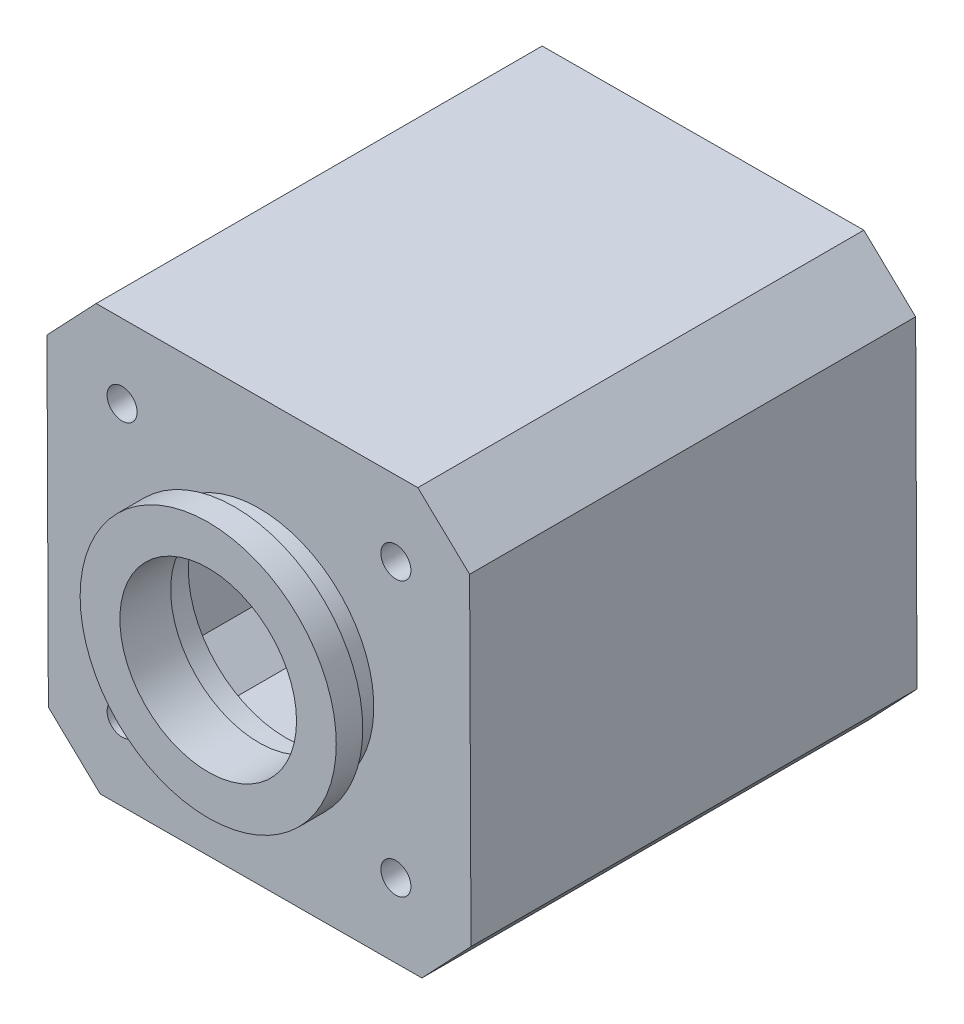
ISO-10303-21;
HEADER;
FILE_DESCRIPTION(('STEP AP214'),'2;1');
FILE_NAME('part.step','',(''),(''),'','','');
FILE_SCHEMA(('AUTOMOTIVE_DESIGN { 1 0 10303 214 1 1 1 1 }'));
ENDSEC;
DATA;
#1=APPLICATION_CONTEXT('core data for automotive mechanical design processes');
#2=APPLICATION_PROTOCOL_DEFINITION('international standard','automotive_design',2000,#1);
#3=PRODUCT_CONTEXT('',#1,'mechanical');
#4=PRODUCT('Part','Part','',(#3));
#5=PRODUCT_RELATED_PRODUCT_CATEGORY('part','',(#4));
#6=PRODUCT_DEFINITION_FORMATION('','',#4);
#7=PRODUCT_DEFINITION_CONTEXT('part definition',#1,'design');
#8=PRODUCT_DEFINITION('design','',#6,#7);
#9=PRODUCT_DEFINITION_SHAPE('','',#8);
#10=(LENGTH_UNIT() NAMED_UNIT(*) SI_UNIT(.MILLI.,.METRE.));
#11=(NAMED_UNIT(*) PLANE_ANGLE_UNIT() SI_UNIT($,.RADIAN.));
#12=(NAMED_UNIT(*) SI_UNIT($,.STERADIAN.) SOLID_ANGLE_UNIT());
#13=UNCERTAINTY_MEASURE_WITH_UNIT(LENGTH_MEASURE(1.E-05),#10,'distance_accuracy_value','');
#14=(GEOMETRIC_REPRESENTATION_CONTEXT(3) GLOBAL_UNCERTAINTY_ASSIGNED_CONTEXT((#13)) GLOBAL_UNIT_ASSIGNED_CONTEXT((#10,
#11,#12)) REPRESENTATION_CONTEXT('',''));
#15=CARTESIAN_POINT('',(0.,0.,0.));
#16=DIRECTION('',(0.,0.,1.));
#17=DIRECTION('',(1.,0.,0.));
#18=AXIS2_PLACEMENT_3D('',#15,#16,#17);
#19=CARTESIAN_POINT('',(-0.058605732675205,-0.398232278057636,10.25));
#20=DIRECTION('',(0.,0.,-1.));
#21=DIRECTION('',(-1.,0.,0.));
#22=AXIS2_PLACEMENT_3D('',#19,#20,#21);
#23=CYLINDRICAL_SURFACE('',#22,13.);
#24=CARTESIAN_POINT('',(-0.058605732675205,-0.398232278057636,3.));
#25=DIRECTION('',(0.,0.,-1.));
#26=DIRECTION('',(-1.,0.,0.));
#27=AXIS2_PLACEMENT_3D('',#24,#25,#26);
#28=CIRCLE('',#27,13.);
#29=CARTESIAN_POINT('',(-13.0586057326752,-0.398232278057636,3.));
#30=VERTEX_POINT('',#29);
#31=EDGE_CURVE('E54',#30,#30,#28,.F.);
#32=CARTESIAN_POINT('',(-0.058605732675205,-0.398232278057636,5.75));
#33=DIRECTION('',(0.,0.,1.));
#34=DIRECTION('',(1.,0.,0.));
#35=AXIS2_PLACEMENT_3D('',#32,#33,#34);
#36=CIRCLE('',#35,13.);
#37=CARTESIAN_POINT('',(-13.0586057326752,-0.398232278057636,5.75));
#38=VERTEX_POINT('',#37);
#39=EDGE_CURVE('E11',#38,#38,#36,.T.);
#40=CARTESIAN_POINT('',(-13.0586057326752,-0.398232278057636,3.));
#41=CARTESIAN_POINT('',(-13.0586057326752,-0.398232278057636,3.02864583333333));
#42=CARTESIAN_POINT('',(-13.0586057326752,-0.398232278057636,3.05729166666667));
#43=CARTESIAN_POINT('',(-13.0586057326752,-0.398232278057636,3.11458333333333));
#44=CARTESIAN_POINT('',(-13.0586057326752,-0.398232278057636,3.14322916666667));
#45=CARTESIAN_POINT('',(-13.0586057326752,-0.398232278057636,3.20052083333333));
#46=CARTESIAN_POINT('',(-13.0586057326752,-0.398232278057636,3.22916666666667));
#47=CARTESIAN_POINT('',(-13.0586057326752,-0.398232278057636,3.28645833333333));
#48=CARTESIAN_POINT('',(-13.0586057326752,-0.398232278057636,3.31510416666667));
#49=CARTESIAN_POINT('',(-13.0586057326752,-0.398232278057636,3.37239583333333));
#50=CARTESIAN_POINT('',(-13.0586057326752,-0.398232278057636,3.40104166666667));
#51=CARTESIAN_POINT('',(-13.0586057326752,-0.398232278057636,3.45833333333333));
#52=CARTESIAN_POINT('',(-13.0586057326752,-0.398232278057636,3.48697916666667));
#53=CARTESIAN_POINT('',(-13.0586057326752,-0.398232278057636,3.54427083333333));
#54=CARTESIAN_POINT('',(-13.0586057326752,-0.398232278057636,3.57291666666667));
#55=CARTESIAN_POINT('',(-13.0586057326752,-0.398232278057636,3.63020833333333));
#56=CARTESIAN_POINT('',(-13.0586057326752,-0.398232278057636,3.65885416666667));
#57=CARTESIAN_POINT('',(-13.0586057326752,-0.398232278057636,3.71614583333333));
#58=CARTESIAN_POINT('',(-13.0586057326752,-0.398232278057636,3.74479166666667));
#59=CARTESIAN_POINT('',(-13.0586057326752,-0.398232278057636,3.80208333333333));
#60=CARTESIAN_POINT('',(-13.0586057326752,-0.398232278057636,3.83072916666667));
#61=CARTESIAN_POINT('',(-13.0586057326752,-0.398232278057636,3.88802083333333));
#62=CARTESIAN_POINT('',(-13.0586057326752,-0.398232278057636,3.91666666666667));
#63=CARTESIAN_POINT('',(-13.0586057326752,-0.398232278057636,3.97395833333333));
#64=CARTESIAN_POINT('',(-13.0586057326752,-0.398232278057636,4.00260416666667));
#65=CARTESIAN_POINT('',(-13.0586057326752,-0.398232278057636,4.05989583333333));
#66=CARTESIAN_POINT('',(-13.0586057326752,-0.398232278057636,4.08854166666667));
#67=CARTESIAN_POINT('',(-13.0586057326752,-0.398232278057636,4.14583333333333));
#68=CARTESIAN_POINT('',(-13.0586057326752,-0.398232278057636,4.17447916666667));
#69=CARTESIAN_POINT('',(-13.0586057326752,-0.398232278057636,4.23177083333333));
#70=CARTESIAN_POINT('',(-13.0586057326752,-0.398232278057636,4.26041666666667));
#71=CARTESIAN_POINT('',(-13.0586057326752,-0.398232278057636,4.31770833333333));
#72=CARTESIAN_POINT('',(-13.0586057326752,-0.398232278057636,4.34635416666667));
#73=CARTESIAN_POINT('',(-13.0586057326752,-0.398232278057636,4.40364583333333));
#74=CARTESIAN_POINT('',(-13.0586057326752,-0.398232278057636,4.43229166666667));
#75=CARTESIAN_POINT('',(-13.0586057326752,-0.398232278057636,4.48958333333333));
#76=CARTESIAN_POINT('',(-13.0586057326752,-0.398232278057636,4.51822916666667));
#77=CARTESIAN_POINT('',(-13.0586057326752,-0.398232278057636,4.57552083333333));
#78=CARTESIAN_POINT('',(-13.0586057326752,-0.398232278057636,4.60416666666667));
#79=CARTESIAN_POINT('',(-13.0586057326752,-0.398232278057636,4.66145833333333));
#80=CARTESIAN_POINT('',(-13.0586057326752,-0.398232278057636,4.69010416666667));
#81=CARTESIAN_POINT('',(-13.0586057326752,-0.398232278057636,4.74739583333333));
#82=CARTESIAN_POINT('',(-13.0586057326752,-0.398232278057636,4.77604166666667));
#83=CARTESIAN_POINT('',(-13.0586057326752,-0.398232278057636,4.83333333333333));
#84=CARTESIAN_POINT('',(-13.0586057326752,-0.398232278057636,4.86197916666667));
#85=CARTESIAN_POINT('',(-13.0586057326752,-0.398232278057636,4.91927083333333));
#86=CARTESIAN_POINT('',(-13.0586057326752,-0.398232278057636,4.94791666666667));
#87=CARTESIAN_POINT('',(-13.0586057326752,-0.398232278057636,5.00520833333333));
#88=CARTESIAN_POINT('',(-13.0586057326752,-0.398232278057636,5.03385416666667));
#89=CARTESIAN_POINT('',(-13.0586057326752,-0.398232278057636,5.09114583333333));
#90=CARTESIAN_POINT('',(-13.0586057326752,-0.398232278057636,5.11979166666667));
#91=CARTESIAN_POINT('',(-13.0586057326752,-0.398232278057636,5.17708333333333));
#92=CARTESIAN_POINT('',(-13.0586057326752,-0.398232278057636,5.20572916666667));
#93=CARTESIAN_POINT('',(-13.0586057326752,-0.398232278057636,5.26302083333333));
#94=CARTESIAN_POINT('',(-13.0586057326752,-0.398232278057636,5.29166666666667));
#95=CARTESIAN_POINT('',(-13.0586057326752,-0.398232278057636,5.34895833333333));
#96=CARTESIAN_POINT('',(-13.0586057326752,-0.398232278057636,5.37760416666667));
#97=CARTESIAN_POINT('',(-13.0586057326752,-0.398232278057636,5.43489583333333));
#98=CARTESIAN_POINT('',(-13.0586057326752,-0.398232278057636,5.46354166666667));
#99=CARTESIAN_POINT('',(-13.0586057326752,-0.398232278057636,5.52083333333333));
#100=CARTESIAN_POINT('',(-13.0586057326752,-0.398232278057636,5.54947916666667));
#101=CARTESIAN_POINT('',(-13.0586057326752,-0.398232278057636,5.60677083333333));
#102=CARTESIAN_POINT('',(-13.0586057326752,-0.398232278057636,5.63541666666667));
#103=CARTESIAN_POINT('',(-13.0586057326752,-0.398232278057636,5.69270833333333));
#104=CARTESIAN_POINT('',(-13.0586057326752,-0.398232278057636,5.72135416666667));
#105=CARTESIAN_POINT('',(-13.0586057326752,-0.398232278057636,5.75));
#106=B_SPLINE_CURVE_WITH_KNOTS('',3,(#40,#41,#42,#43,#44,#45,#46,#47,#48,#49,#50,#51,#52,#53,
#54,#55,#56,#57,#58,#59,#60,#61,#62,#63,#64,#65,#66,#67,#68,#69,#70,#71,#72,#73,#74,#75,#76,#77,
#78,#79,#80,#81,#82,#83,#84,#85,#86,#87,#88,#89,#90,#91,#92,#93,#94,#95,#96,#97,#98,#99,#100,
#101,#102,#103,#104,#105),.UNSPECIFIED.,.F.,.F.,(4,2,2,2,2,2,2,2,2,2,2,2,2,2,2,2,2,2,2,2,2,2,2,
2,2,2,2,2,2,2,2,2,4),(0.,0.0859375000000001,0.171875,0.2578125,0.34375,0.4296875,0.515625,
0.6015625,0.687500000000001,0.7734375,0.859375,0.9453125,1.03125,1.1171875,1.203125,1.2890625,
1.375,1.4609375,1.546875,1.6328125,1.71875,1.8046875,1.890625,1.9765625,2.0625,2.1484375,
2.234375,2.3203125,2.40625,2.4921875,2.578125,2.6640625,2.75),.UNSPECIFIED.);
#107=EDGE_CURVE('BSEAM45',#30,#38,#106,.T.);
#108=ORIENTED_EDGE('',*,*,#31,.T.);
#109=ORIENTED_EDGE('',*,*,#39,.F.);
#110=ORIENTED_EDGE('',*,*,#107,.T.);
#111=ORIENTED_EDGE('',*,*,#107,.F.);
#112=EDGE_LOOP('',(#108,#110,#109,#111));
#113=FACE_BOUND('',#112,.T.);
#114=ADVANCED_FACE('F45',(#113),#23,.T.);
#115=CARTESIAN_POINT('',(-0.058605732675205,-0.398232278057636,-3.75));
#116=DIRECTION('',(0.,0.,1.));
#117=DIRECTION('',(1.,0.,0.));
#118=AXIS2_PLACEMENT_3D('',#115,#116,#117);
#119=CYLINDRICAL_SURFACE('',#118,10.);
#120=CARTESIAN_POINT('',(-0.058605732675205,-0.398232278057636,3.));
#121=DIRECTION('',(0.,0.,1.));
#122=DIRECTION('',(1.,0.,0.));
#123=AXIS2_PLACEMENT_3D('',#120,#121,#122);
#124=CIRCLE('',#123,10.);
#125=CARTESIAN_POINT('',(9.9413942673248,-0.398232278057636,3.));
#126=VERTEX_POINT('',#125);
#127=EDGE_CURVE('E327',#126,#126,#124,.T.);
#128=ORIENTED_EDGE('',*,*,#127,.F.);
#129=EDGE_LOOP('',(#128));
#130=FACE_BOUND('',#129,.T.);
#131=CARTESIAN_POINT('',(-0.058605732675205,-0.398232278057636,8.75));
#132=DIRECTION('',(0.,0.,1.));
#133=DIRECTION('',(1.,0.,0.));
#134=AXIS2_PLACEMENT_3D('',#131,#132,#133);
#135=CIRCLE('',#134,10.);
#136=CARTESIAN_POINT('',(9.9413942673248,-0.398232278057636,8.75));
#137=VERTEX_POINT('',#136);
#138=EDGE_CURVE('E323',#137,#137,#135,.F.);
#139=ORIENTED_EDGE('',*,*,#138,.F.);
#140=EDGE_LOOP('',(#139));
#141=FACE_BOUND('',#140,.T.);
#142=ADVANCED_FACE('F407',(#130,#141),#119,.F.);
#143=CARTESIAN_POINT('',(0.,0.,3.));
#144=DIRECTION('',(0.,0.,-1.));
#145=DIRECTION('',(-1.,0.,0.));
#146=AXIS2_PLACEMENT_3D('',#143,#144,#145);
#147=PLANE('',#146);
#148=ORIENTED_EDGE('',*,*,#31,.F.);
#149=EDGE_LOOP('',(#148));
#150=FACE_BOUND('',#149,.T.);
#151=CARTESIAN_POINT('',(-15.5586057326753,15.1017677219424,3.));
#152=DIRECTION('',(0.,0.,1.));
#153=DIRECTION('',(1.,0.,0.));
#154=AXIS2_PLACEMENT_3D('',#151,#152,#153);
#155=CIRCLE('',#154,1.7);
#156=CARTESIAN_POINT('',(-13.8586057326753,15.1017677219424,3.));
#157=VERTEX_POINT('',#156);
#158=EDGE_CURVE('E361',#157,#157,#155,.T.);
#159=ORIENTED_EDGE('',*,*,#158,.F.);
#160=EDGE_LOOP('',(#159));
#161=FACE_BOUND('',#160,.T.);
#162=CARTESIAN_POINT('',(15.4413942673247,15.1017677219424,3.));
#163=DIRECTION('',(0.,0.,1.));
#164=DIRECTION('',(1.,0.,0.));
#165=AXIS2_PLACEMENT_3D('',#162,#163,#164);
#166=CIRCLE('',#165,1.7);
#167=CARTESIAN_POINT('',(17.1413942673247,15.1017677219424,3.));
#168=VERTEX_POINT('',#167);
#169=EDGE_CURVE('E353',#168,#168,#166,.T.);
#170=ORIENTED_EDGE('',*,*,#169,.F.);
#171=EDGE_LOOP('',(#170));
#172=FACE_BOUND('',#171,.T.);
#173=CARTESIAN_POINT('',(15.4413942673247,-15.8982322780576,3.));
#174=DIRECTION('',(0.,0.,1.));
#175=DIRECTION('',(1.,0.,0.));
#176=AXIS2_PLACEMENT_3D('',#173,#174,#175);
#177=CIRCLE('',#176,1.7);
#178=CARTESIAN_POINT('',(17.1413942673247,-15.8982322780576,3.));
#179=VERTEX_POINT('',#178);
#180=EDGE_CURVE('E345',#179,#179,#177,.T.);
#181=ORIENTED_EDGE('',*,*,#180,.F.);
#182=EDGE_LOOP('',(#181));
#183=FACE_BOUND('',#182,.T.);
#184=CARTESIAN_POINT('',(-15.5586057326753,-15.8982322780576,3.));
#185=DIRECTION('',(0.,0.,1.));
#186=DIRECTION('',(1.,0.,0.));
#187=AXIS2_PLACEMENT_3D('',#184,#185,#186);
#188=CIRCLE('',#187,1.7);
#189=CARTESIAN_POINT('',(-13.8586057326753,-15.8982322780576,3.));
#190=VERTEX_POINT('',#189);
#191=EDGE_CURVE('E336',#190,#190,#188,.T.);
#192=ORIENTED_EDGE('',*,*,#191,.F.);
#193=EDGE_LOOP('',(#192));
#194=FACE_BOUND('',#193,.T.);
#195=DIRECTION('',(-0.00431491145191215,0.99999069072625,0.));
#196=VECTOR('',#195,1.);
#197=CARTESIAN_POINT('',(23.9465632931381,-18.3825867654019,3.));
#198=LINE('',#197,#196);
#199=CARTESIAN_POINT('',(23.9465632931381,-18.3825867654019,3.));
#200=VERTEX_POINT('',#199);
#201=CARTESIAN_POINT('',(23.789391415238,18.042358797378,3.));
#202=VERTEX_POINT('',#201);
#203=EDGE_CURVE('E208',#200,#202,#198,.T.);
#204=ORIENTED_EDGE('',*,*,#203,.T.);
#205=DIRECTION('',(-0.725362707070742,0.688366866714984,0.));
#206=VECTOR('',#205,1.);
#207=CARTESIAN_POINT('',(23.789391415238,18.042358797378,3.));
#208=LINE('',#207,#206);
#209=CARTESIAN_POINT('',(17.9257487546692,23.6069367477556,3.));
#210=VERTEX_POINT('',#209);
#211=EDGE_CURVE('E268',#202,#210,#208,.T.);
#212=ORIENTED_EDGE('',*,*,#211,.T.);
#213=DIRECTION('',(-0.99999069072625,-0.00431491145191209,0.));
#214=VECTOR('',#213,1.);
#215=CARTESIAN_POINT('',(17.9257487546692,23.6069367477556,3.));
#216=LINE('',#215,#214);
#217=CARTESIAN_POINT('',(-18.4991968081112,23.4497648698554,3.));
#218=VERTEX_POINT('',#217);
#219=EDGE_CURVE('E272',#210,#218,#216,.T.);
#220=ORIENTED_EDGE('',*,*,#219,.T.);
#221=DIRECTION('',(-0.688366866714984,-0.725362707070742,0.));
#222=VECTOR('',#221,1.);
#223=CARTESIAN_POINT('',(-24.0637747584885,17.5861222092869,3.));
#224=LINE('',#223,#222);
#225=CARTESIAN_POINT('',(-24.0637747584885,17.5861222092869,3.));
#226=VERTEX_POINT('',#225);
#227=EDGE_CURVE('E276',#218,#226,#224,.T.);
#228=ORIENTED_EDGE('',*,*,#227,.T.);
#229=DIRECTION('',(0.00431491145191209,-0.99999069072625,0.));
#230=VECTOR('',#229,1.);
#231=CARTESIAN_POINT('',(-24.0637747584885,17.5861222092869,3.));
#232=LINE('',#231,#230);
#233=CARTESIAN_POINT('',(-23.9066028805884,-18.8388233534935,3.));
#234=VERTEX_POINT('',#233);
#235=EDGE_CURVE('E280',#226,#234,#232,.T.);
#236=ORIENTED_EDGE('',*,*,#235,.T.);
#237=DIRECTION('',(0.725362707070742,-0.688366866714984,0.));
#238=VECTOR('',#237,1.);
#239=CARTESIAN_POINT('',(-23.9066028805884,-18.8388233534935,3.));
#240=LINE('',#239,#238);
#241=CARTESIAN_POINT('',(-18.0429602200199,-24.4034013038709,3.));
#242=VERTEX_POINT('',#241);
#243=EDGE_CURVE('E284',#234,#242,#240,.T.);
#244=ORIENTED_EDGE('',*,*,#243,.T.);
#245=DIRECTION('',(0.99999069072625,0.00431491145191209,0.));
#246=VECTOR('',#245,1.);
#247=CARTESIAN_POINT('',(-18.0429602200199,-24.4034013038709,3.));
#248=LINE('',#247,#246);
#249=CARTESIAN_POINT('',(18.3819853427606,-24.2462294259707,3.));
#250=VERTEX_POINT('',#249);
#251=EDGE_CURVE('E288',#242,#250,#248,.T.);
#252=ORIENTED_EDGE('',*,*,#251,.T.);
#253=DIRECTION('',(0.688366866714984,0.725362707070743,0.));
#254=VECTOR('',#253,1.);
#255=CARTESIAN_POINT('',(18.3819853427606,-24.2462294259707,3.));
#256=LINE('',#255,#254);
#257=EDGE_CURVE('E236',#250,#200,#256,.T.);
#258=ORIENTED_EDGE('',*,*,#257,.T.);
#259=EDGE_LOOP('',(#204,#212,#220,#228,#236,#244,#252,#258));
#260=FACE_BOUND('',#259,.T.);
#261=ADVANCED_FACE('F409',(#150,#161,#172,#183,#194,#260),#147,.F.);
#262=CARTESIAN_POINT('',(0.,0.,0.));
#263=DIRECTION('',(0.,0.,-1.));
#264=DIRECTION('',(-1.,0.,0.));
#265=AXIS2_PLACEMENT_3D('',#262,#263,#264);
#266=PLANE('',#265);
#267=CARTESIAN_POINT('',(-0.058605732675205,-0.398232278057636,0.));
#268=DIRECTION('',(0.,0.,-1.));
#269=DIRECTION('',(-1.,0.,0.));
#270=AXIS2_PLACEMENT_3D('',#267,#268,#269);
#271=CIRCLE('',#270,11.);
#272=CARTESIAN_POINT('',(-11.0586057326752,-0.398232278057636,0.));
#273=VERTEX_POINT('',#272);
#274=EDGE_CURVE('E335',#273,#273,#271,.T.);
#275=ORIENTED_EDGE('',*,*,#274,.F.);
#276=EDGE_LOOP('',(#275));
#277=FACE_BOUND('',#276,.T.);
#278=CARTESIAN_POINT('',(15.4413942673247,-15.8982322780576,0.));
#279=DIRECTION('',(0.,0.,1.));
#280=DIRECTION('',(1.,0.,0.));
#281=AXIS2_PLACEMENT_3D('',#278,#279,#280);
#282=CIRCLE('',#281,1.7);
#283=CARTESIAN_POINT('',(17.1413942673247,-15.8982322780576,0.));
#284=VERTEX_POINT('',#283);
#285=EDGE_CURVE('E340',#284,#284,#282,.T.);
#286=ORIENTED_EDGE('',*,*,#285,.T.);
#287=EDGE_LOOP('',(#286));
#288=FACE_BOUND('',#287,.T.);
#289=CARTESIAN_POINT('',(-15.5586057326753,15.1017677219424,0.));
#290=DIRECTION('',(0.,0.,1.));
#291=DIRECTION('',(1.,0.,0.));
#292=AXIS2_PLACEMENT_3D('',#289,#290,#291);
#293=CIRCLE('',#292,1.7);
#294=CARTESIAN_POINT('',(-13.8586057326753,15.1017677219424,0.));
#295=VERTEX_POINT('',#294);
#296=EDGE_CURVE('E357',#295,#295,#293,.T.);
#297=ORIENTED_EDGE('',*,*,#296,.T.);
#298=EDGE_LOOP('',(#297));
#299=FACE_BOUND('',#298,.T.);
#300=DIRECTION('',(0.725362707070742,-0.688366866714984,0.));
#301=VECTOR('',#300,1.);
#302=CARTESIAN_POINT('',(-16.8514989514888,-21.3982322780576,0.));
#303=LINE('',#302,#301);
#304=CARTESIAN_POINT('',(-20.9121591232686,-17.5446788874643,0.));
#305=VERTEX_POINT('',#304);
#306=CARTESIAN_POINT('',(-16.8514989514888,-21.3982322780576,0.));
#307=VERTEX_POINT('',#306);
#308=EDGE_CURVE('E61',#305,#307,#303,.T.);
#309=ORIENTED_EDGE('',*,*,#308,.F.);
#310=DIRECTION('',(0.00431491145191209,-0.99999069072625,0.));
#311=VECTOR('',#310,1.);
#312=CARTESIAN_POINT('',(-20.9121591232686,-17.5446788874643,0.));
#313=LINE('',#312,#311);
#314=CARTESIAN_POINT('',(-21.0586057326753,16.3946609407559,0.));
#315=VERTEX_POINT('',#314);
#316=EDGE_CURVE('E65',#315,#305,#313,.T.);
#317=ORIENTED_EDGE('',*,*,#316,.F.);
#318=DIRECTION('',(-0.688366866714984,-0.725362707070742,0.));
#319=VECTOR('',#318,1.);
#320=CARTESIAN_POINT('',(-21.0586057326753,16.3946609407559,0.));
#321=LINE('',#320,#319);
#322=CARTESIAN_POINT('',(-17.205052342082,20.4553211125357,0.));
#323=VERTEX_POINT('',#322);
#324=EDGE_CURVE('E390',#323,#315,#321,.T.);
#325=ORIENTED_EDGE('',*,*,#324,.F.);
#326=DIRECTION('',(-0.99999069072625,-0.00431491145191209,0.));
#327=VECTOR('',#326,1.);
#328=CARTESIAN_POINT('',(-17.205052342082,20.4553211125357,0.));
#329=LINE('',#328,#327);
#330=CARTESIAN_POINT('',(16.7342874861382,20.6017677219424,0.));
#331=VERTEX_POINT('',#330);
#332=EDGE_CURVE('E386',#331,#323,#329,.T.);
#333=ORIENTED_EDGE('',*,*,#332,.F.);
#334=DIRECTION('',(-0.725362707070742,0.688366866714984,0.));
#335=VECTOR('',#334,1.);
#336=CARTESIAN_POINT('',(16.7342874861382,20.6017677219424,0.));
#337=LINE('',#336,#335);
#338=CARTESIAN_POINT('',(20.7949476579182,16.7482143313488,0.));
#339=VERTEX_POINT('',#338);
#340=EDGE_CURVE('E382',#339,#331,#337,.T.);
#341=ORIENTED_EDGE('',*,*,#340,.F.);
#342=DIRECTION('',(-0.00431491145191215,0.99999069072625,0.));
#343=VECTOR('',#342,1.);
#344=CARTESIAN_POINT('',(20.7949476579182,16.7482143313488,0.));
#345=LINE('',#344,#343);
#346=CARTESIAN_POINT('',(20.9413942673249,-17.1911254968709,0.));
#347=VERTEX_POINT('',#346);
#348=EDGE_CURVE('E378',#347,#339,#345,.T.);
#349=ORIENTED_EDGE('',*,*,#348,.F.);
#350=DIRECTION('',(0.688366866714983,0.725362707070743,0.));
#351=VECTOR('',#350,1.);
#352=CARTESIAN_POINT('',(20.9413942673249,-17.1911254968709,0.));
#353=LINE('',#352,#351);
#354=CARTESIAN_POINT('',(17.0878408767314,-21.2517856686509,0.));
#355=VERTEX_POINT('',#354);
#356=EDGE_CURVE('E374',#355,#347,#353,.T.);
#357=ORIENTED_EDGE('',*,*,#356,.F.);
#358=DIRECTION('',(0.99999069072625,0.00431491145191209,0.));
#359=VECTOR('',#358,1.);
#360=CARTESIAN_POINT('',(17.0878408767314,-21.2517856686509,0.));
#361=LINE('',#360,#359);
#362=EDGE_CURVE('E370',#307,#355,#361,.T.);
#363=ORIENTED_EDGE('',*,*,#362,.F.);
#364=EDGE_LOOP('',(#309,#317,#325,#333,#341,#349,#357,#363));
#365=FACE_BOUND('',#364,.T.);
#366=CARTESIAN_POINT('',(15.4413942673247,15.1017677219424,0.));
#367=DIRECTION('',(0.,0.,1.));
#368=DIRECTION('',(1.,0.,0.));
#369=AXIS2_PLACEMENT_3D('',#366,#367,#368);
#370=CIRCLE('',#369,1.7);
#371=CARTESIAN_POINT('',(17.1413942673247,15.1017677219424,0.));
#372=VERTEX_POINT('',#371);
#373=EDGE_CURVE('E349',#372,#372,#370,.T.);
#374=ORIENTED_EDGE('',*,*,#373,.T.);
#375=EDGE_LOOP('',(#374));
#376=FACE_BOUND('',#375,.T.);
#377=CARTESIAN_POINT('',(-15.5586057326753,-15.8982322780576,0.));
#378=DIRECTION('',(0.,0.,1.));
#379=DIRECTION('',(1.,0.,0.));
#380=AXIS2_PLACEMENT_3D('',#377,#378,#379);
#381=CIRCLE('',#380,1.7);
#382=CARTESIAN_POINT('',(-13.8586057326753,-15.8982322780576,0.));
#383=VERTEX_POINT('',#382);
#384=EDGE_CURVE('E341',#383,#383,#381,.T.);
#385=ORIENTED_EDGE('',*,*,#384,.T.);
#386=EDGE_LOOP('',(#385));
#387=FACE_BOUND('',#386,.T.);
#388=ADVANCED_FACE('F47',(#277,#288,#299,#365,#376,#387),#266,.T.);
#389=CARTESIAN_POINT('',(-15.5586057326753,15.1017677219424,3.));
#390=DIRECTION('',(0.,0.,-1.));
#391=DIRECTION('',(-1.,0.,0.));
#392=AXIS2_PLACEMENT_3D('',#389,#390,#391);
#393=CYLINDRICAL_SURFACE('',#392,1.7);
#394=ORIENTED_EDGE('',*,*,#158,.T.);
#395=EDGE_LOOP('',(#394));
#396=FACE_BOUND('',#395,.T.);
#397=ORIENTED_EDGE('',*,*,#296,.F.);
#398=EDGE_LOOP('',(#397));
#399=FACE_BOUND('',#398,.T.);
#400=ADVANCED_FACE('F442',(#396,#399),#393,.F.);
#401=CARTESIAN_POINT('',(15.4413942673247,15.1017677219424,3.));
#402=DIRECTION('',(0.,0.,-1.));
#403=DIRECTION('',(-1.,0.,0.));
#404=AXIS2_PLACEMENT_3D('',#401,#402,#403);
#405=CYLINDRICAL_SURFACE('',#404,1.7);
#406=ORIENTED_EDGE('',*,*,#169,.T.);
#407=EDGE_LOOP('',(#406));
#408=FACE_BOUND('',#407,.T.);
#409=ORIENTED_EDGE('',*,*,#373,.F.);
#410=EDGE_LOOP('',(#409));
#411=FACE_BOUND('',#410,.T.);
#412=ADVANCED_FACE('F438',(#408,#411),#405,.F.);
#413=CARTESIAN_POINT('',(15.4413942673247,-15.8982322780576,3.));
#414=DIRECTION('',(0.,0.,-1.));
#415=DIRECTION('',(-1.,0.,0.));
#416=AXIS2_PLACEMENT_3D('',#413,#414,#415);
#417=CYLINDRICAL_SURFACE('',#416,1.7);
#418=ORIENTED_EDGE('',*,*,#180,.T.);
#419=EDGE_LOOP('',(#418));
#420=FACE_BOUND('',#419,.T.);
#421=ORIENTED_EDGE('',*,*,#285,.F.);
#422=EDGE_LOOP('',(#421));
#423=FACE_BOUND('',#422,.T.);
#424=ADVANCED_FACE('F434',(#420,#423),#417,.F.);
#425=CARTESIAN_POINT('',(-15.5586057326753,-15.8982322780576,3.));
#426=DIRECTION('',(0.,0.,-1.));
#427=DIRECTION('',(-1.,0.,0.));
#428=AXIS2_PLACEMENT_3D('',#425,#426,#427);
#429=CYLINDRICAL_SURFACE('',#428,1.7);
#430=ORIENTED_EDGE('',*,*,#191,.T.);
#431=EDGE_LOOP('',(#430));
#432=FACE_BOUND('',#431,.T.);
#433=ORIENTED_EDGE('',*,*,#384,.F.);
#434=EDGE_LOOP('',(#433));
#435=FACE_BOUND('',#434,.T.);
#436=ADVANCED_FACE('F430',(#432,#435),#429,.F.);
#437=CARTESIAN_POINT('',(-0.058605732675205,-0.398232278057636,-27.));
#438=DIRECTION('',(0.,0.,1.));
#439=DIRECTION('',(1.,0.,0.));
#440=AXIS2_PLACEMENT_3D('',#437,#438,#439);
#441=CYLINDRICAL_SURFACE('',#440,11.);
#442=ORIENTED_EDGE('',*,*,#274,.T.);
#443=EDGE_LOOP('',(#442));
#444=FACE_BOUND('',#443,.T.);
#445=CARTESIAN_POINT('',(-0.058605732675205,-0.398232278057636,3.));
#446=DIRECTION('',(0.,0.,1.));
#447=DIRECTION('',(1.,0.,0.));
#448=AXIS2_PLACEMENT_3D('',#445,#446,#447);
#449=CIRCLE('',#448,11.);
#450=CARTESIAN_POINT('',(10.9413942673248,-0.398232278057636,3.));
#451=VERTEX_POINT('',#450);
#452=EDGE_CURVE('E331',#451,#451,#449,.F.);
#453=ORIENTED_EDGE('',*,*,#452,.F.);
#454=EDGE_LOOP('',(#453));
#455=FACE_BOUND('',#454,.T.);
#456=ADVANCED_FACE('F425',(#444,#455),#441,.F.);
#457=CARTESIAN_POINT('',(-0.058605732675205,-0.398232278057636,3.));
#458=DIRECTION('',(0.,0.,1.));
#459=DIRECTION('',(1.,0.,0.));
#460=AXIS2_PLACEMENT_3D('',#457,#458,#459);
#461=PLANE('',#460);
#462=ORIENTED_EDGE('',*,*,#127,.T.);
#463=EDGE_LOOP('',(#462));
#464=FACE_BOUND('',#463,.T.);
#465=ORIENTED_EDGE('',*,*,#452,.T.);
#466=EDGE_LOOP('',(#465));
#467=FACE_BOUND('',#466,.T.);
#468=ADVANCED_FACE('F424',(#464,#467),#461,.F.);
#469=CARTESIAN_POINT('',(-0.058605732675205,-0.398232278057636,8.75));
#470=DIRECTION('',(0.,0.,1.));
#471=DIRECTION('',(1.,0.,0.));
#472=AXIS2_PLACEMENT_3D('',#469,#470,#471);
#473=PLANE('',#472);
#474=ORIENTED_EDGE('',*,*,#138,.T.);
#475=EDGE_LOOP('',(#474));
#476=FACE_BOUND('',#475,.T.);
#477=CARTESIAN_POINT('',(-0.058605732675205,-0.398232278057636,8.75));
#478=DIRECTION('',(0.,0.,1.));
#479=DIRECTION('',(1.,0.,0.));
#480=AXIS2_PLACEMENT_3D('',#477,#478,#479);
#481=CIRCLE('',#480,14.5);
#482=CARTESIAN_POINT('',(14.4413942673248,-0.398232278057636,8.75));
#483=VERTEX_POINT('',#482);
#484=EDGE_CURVE('E298',#483,#483,#481,.T.);
#485=ORIENTED_EDGE('',*,*,#484,.T.);
#486=EDGE_LOOP('',(#485));
#487=FACE_BOUND('',#486,.T.);
#488=ADVANCED_FACE('F404',(#476,#487),#473,.T.);
#489=CARTESIAN_POINT('',(-0.058605732675205,-0.398232278057636,5.75));
#490=DIRECTION('',(0.,0.,1.));
#491=DIRECTION('',(1.,0.,0.));
#492=AXIS2_PLACEMENT_3D('',#489,#490,#491);
#493=CYLINDRICAL_SURFACE('',#492,14.5);
#494=CARTESIAN_POINT('',(-0.058605732675205,-0.398232278057636,5.75));
#495=DIRECTION('',(0.,0.,1.));
#496=DIRECTION('',(1.,0.,0.));
#497=AXIS2_PLACEMENT_3D('',#494,#495,#496);
#498=CIRCLE('',#497,14.5);
#499=CARTESIAN_POINT('',(14.4413942673248,-0.398232278057636,5.75));
#500=VERTEX_POINT('',#499);
#501=EDGE_CURVE('E319',#500,#500,#498,.T.);
#502=ORIENTED_EDGE('',*,*,#501,.T.);
#503=EDGE_LOOP('',(#502));
#504=FACE_BOUND('',#503,.T.);
#505=ORIENTED_EDGE('',*,*,#484,.F.);
#506=EDGE_LOOP('',(#505));
#507=FACE_BOUND('',#506,.T.);
#508=ADVANCED_FACE('F522',(#504,#507),#493,.T.);
#509=CARTESIAN_POINT('',(-0.058605732675205,-0.398232278057636,5.75));
#510=DIRECTION('',(0.,0.,1.));
#511=DIRECTION('',(1.,0.,0.));
#512=AXIS2_PLACEMENT_3D('',#509,#510,#511);
#513=PLANE('',#512);
#514=ORIENTED_EDGE('',*,*,#39,.T.);
#515=EDGE_LOOP('',(#514));
#516=FACE_BOUND('',#515,.T.);
#517=ORIENTED_EDGE('',*,*,#501,.F.);
#518=EDGE_LOOP('',(#517));
#519=FACE_BOUND('',#518,.T.);
#520=ADVANCED_FACE('F520',(#516,#519),#513,.F.);
#521=CARTESIAN_POINT('',(23.9465632931381,-18.3825867654019,-47.5));
#522=DIRECTION('',(0.99999069072625,0.00431491145191215,0.));
#523=DIRECTION('',(-0.00431491145191215,0.99999069072625,0.));
#524=AXIS2_PLACEMENT_3D('',#521,#522,#523);
#525=PLANE('',#524);
#526=ORIENTED_EDGE('',*,*,#203,.F.);
#527=DIRECTION('',(0.,0.,1.));
#528=VECTOR('',#527,1.);
#529=CARTESIAN_POINT('',(23.9465632931381,-18.3825867654019,-47.5));
#530=LINE('',#529,#528);
#531=CARTESIAN_POINT('',(23.9465632931381,-18.3825867654019,-47.5));
#532=VERTEX_POINT('',#531);
#533=EDGE_CURVE('E295',#532,#200,#530,.T.);
#534=ORIENTED_EDGE('',*,*,#533,.F.);
#535=DIRECTION('',(-0.00431491145191215,0.99999069072625,0.));
#536=VECTOR('',#535,1.);
#537=CARTESIAN_POINT('',(23.9465632931381,-18.3825867654019,-47.5));
#538=LINE('',#537,#536);
#539=CARTESIAN_POINT('',(23.789391415238,18.042358797378,-47.5));
#540=VERTEX_POINT('',#539);
#541=EDGE_CURVE('E231',#532,#540,#538,.T.);
#542=ORIENTED_EDGE('',*,*,#541,.T.);
#543=DIRECTION('',(0.,0.,1.));
#544=VECTOR('',#543,1.);
#545=CARTESIAN_POINT('',(23.789391415238,18.042358797378,-47.5));
#546=LINE('',#545,#544);
#547=EDGE_CURVE('E264',#540,#202,#546,.T.);
#548=ORIENTED_EDGE('',*,*,#547,.T.);
#549=EDGE_LOOP('',(#526,#534,#542,#548));
#550=FACE_BOUND('',#549,.T.);
#551=ADVANCED_FACE('F472',(#550),#525,.T.);
#552=CARTESIAN_POINT('',(18.3819853427606,-24.2462294259707,-47.5));
#553=DIRECTION('',(0.725362707070743,-0.688366866714984,0.));
#554=DIRECTION('',(0.688366866714984,0.725362707070743,0.));
#555=AXIS2_PLACEMENT_3D('',#552,#553,#554);
#556=PLANE('',#555);
#557=ORIENTED_EDGE('',*,*,#257,.F.);
#558=DIRECTION('',(0.,0.,1.));
#559=VECTOR('',#558,1.);
#560=CARTESIAN_POINT('',(18.3819853427606,-24.2462294259707,-47.5));
#561=LINE('',#560,#559);
#562=CARTESIAN_POINT('',(18.3819853427606,-24.2462294259707,-47.5));
#563=VERTEX_POINT('',#562);
#564=EDGE_CURVE('E299',#563,#250,#561,.T.);
#565=ORIENTED_EDGE('',*,*,#564,.F.);
#566=DIRECTION('',(0.688366866714984,0.725362707070743,0.));
#567=VECTOR('',#566,1.);
#568=CARTESIAN_POINT('',(18.3819853427606,-24.2462294259707,-47.5));
#569=LINE('',#568,#567);
#570=EDGE_CURVE('E260',#563,#532,#569,.T.);
#571=ORIENTED_EDGE('',*,*,#570,.T.);
#572=ORIENTED_EDGE('',*,*,#533,.T.);
#573=EDGE_LOOP('',(#557,#565,#571,#572));
#574=FACE_BOUND('',#573,.T.);
#575=ADVANCED_FACE('F496',(#574),#556,.T.);
#576=CARTESIAN_POINT('',(-18.0429602200199,-24.4034013038709,-47.5));
#577=DIRECTION('',(0.00431491145191209,-0.99999069072625,0.));
#578=DIRECTION('',(0.99999069072625,0.00431491145191209,0.));
#579=AXIS2_PLACEMENT_3D('',#576,#577,#578);
#580=PLANE('',#579);
#581=ORIENTED_EDGE('',*,*,#251,.F.);
#582=DIRECTION('',(0.,0.,1.));
#583=VECTOR('',#582,1.);
#584=CARTESIAN_POINT('',(-18.0429602200199,-24.4034013038709,-47.5));
#585=LINE('',#584,#583);
#586=CARTESIAN_POINT('',(-18.0429602200199,-24.4034013038709,-47.5));
#587=VERTEX_POINT('',#586);
#588=EDGE_CURVE('E302',#587,#242,#585,.T.);
#589=ORIENTED_EDGE('',*,*,#588,.F.);
#590=DIRECTION('',(0.99999069072625,0.00431491145191209,0.));
#591=VECTOR('',#590,1.);
#592=CARTESIAN_POINT('',(-18.0429602200199,-24.4034013038709,-47.5));
#593=LINE('',#592,#591);
#594=EDGE_CURVE('E256',#587,#563,#593,.T.);
#595=ORIENTED_EDGE('',*,*,#594,.T.);
#596=ORIENTED_EDGE('',*,*,#564,.T.);
#597=EDGE_LOOP('',(#581,#589,#595,#596));
#598=FACE_BOUND('',#597,.T.);
#599=ADVANCED_FACE('F499',(#598),#580,.T.);
#600=CARTESIAN_POINT('',(-23.9066028805884,-18.8388233534935,-47.5));
#601=DIRECTION('',(-0.688366866714984,-0.725362707070742,0.));
#602=DIRECTION('',(0.725362707070742,-0.688366866714984,0.));
#603=AXIS2_PLACEMENT_3D('',#600,#601,#602);
#604=PLANE('',#603);
#605=ORIENTED_EDGE('',*,*,#243,.F.);
#606=DIRECTION('',(0.,0.,1.));
#607=VECTOR('',#606,1.);
#608=CARTESIAN_POINT('',(-23.9066028805884,-18.8388233534935,-47.5));
#609=LINE('',#608,#607);
#610=CARTESIAN_POINT('',(-23.9066028805884,-18.8388233534935,-47.5));
#611=VERTEX_POINT('',#610);
#612=EDGE_CURVE('E305',#611,#234,#609,.T.);
#613=ORIENTED_EDGE('',*,*,#612,.F.);
#614=DIRECTION('',(0.725362707070742,-0.688366866714984,0.));
#615=VECTOR('',#614,1.);
#616=CARTESIAN_POINT('',(-23.9066028805884,-18.8388233534935,-47.5));
#617=LINE('',#616,#615);
#618=EDGE_CURVE('E252',#611,#587,#617,.T.);
#619=ORIENTED_EDGE('',*,*,#618,.T.);
#620=ORIENTED_EDGE('',*,*,#588,.T.);
#621=EDGE_LOOP('',(#605,#613,#619,#620));
#622=FACE_BOUND('',#621,.T.);
#623=ADVANCED_FACE('F492',(#622),#604,.T.);
#624=CARTESIAN_POINT('',(-24.0637747584885,17.5861222092869,-47.5));
#625=DIRECTION('',(-0.99999069072625,-0.00431491145191209,0.));
#626=DIRECTION('',(0.00431491145191209,-0.99999069072625,0.));
#627=AXIS2_PLACEMENT_3D('',#624,#625,#626);
#628=PLANE('',#627);
#629=ORIENTED_EDGE('',*,*,#235,.F.);
#630=DIRECTION('',(0.,0.,1.));
#631=VECTOR('',#630,1.);
#632=CARTESIAN_POINT('',(-24.0637747584885,17.5861222092869,-47.5));
#633=LINE('',#632,#631);
#634=CARTESIAN_POINT('',(-24.0637747584885,17.5861222092869,-47.5));
#635=VERTEX_POINT('',#634);
#636=EDGE_CURVE('E308',#635,#226,#633,.T.);
#637=ORIENTED_EDGE('',*,*,#636,.F.);
#638=DIRECTION('',(0.00431491145191209,-0.99999069072625,0.));
#639=VECTOR('',#638,1.);
#640=CARTESIAN_POINT('',(-24.0637747584885,17.5861222092869,-47.5));
#641=LINE('',#640,#639);
#642=EDGE_CURVE('E248',#635,#611,#641,.T.);
#643=ORIENTED_EDGE('',*,*,#642,.T.);
#644=ORIENTED_EDGE('',*,*,#612,.T.);
#645=EDGE_LOOP('',(#629,#637,#643,#644));
#646=FACE_BOUND('',#645,.T.);
#647=ADVANCED_FACE('F488',(#646),#628,.T.);
#648=CARTESIAN_POINT('',(-24.0637747584885,17.5861222092869,-47.5));
#649=DIRECTION('',(-0.725362707070742,0.688366866714984,0.));
#650=DIRECTION('',(-0.688366866714984,-0.725362707070742,0.));
#651=AXIS2_PLACEMENT_3D('',#648,#649,#650);
#652=PLANE('',#651);
#653=ORIENTED_EDGE('',*,*,#227,.F.);
#654=DIRECTION('',(0.,0.,1.));
#655=VECTOR('',#654,1.);
#656=CARTESIAN_POINT('',(-18.4991968081112,23.4497648698554,-47.5));
#657=LINE('',#656,#655);
#658=CARTESIAN_POINT('',(-18.4991968081112,23.4497648698554,-47.5));
#659=VERTEX_POINT('',#658);
#660=EDGE_CURVE('E311',#659,#218,#657,.T.);
#661=ORIENTED_EDGE('',*,*,#660,.F.);
#662=DIRECTION('',(-0.688366866714984,-0.725362707070742,0.));
#663=VECTOR('',#662,1.);
#664=CARTESIAN_POINT('',(-24.0637747584885,17.5861222092869,-47.5));
#665=LINE('',#664,#663);
#666=EDGE_CURVE('E244',#659,#635,#665,.T.);
#667=ORIENTED_EDGE('',*,*,#666,.T.);
#668=ORIENTED_EDGE('',*,*,#636,.T.);
#669=EDGE_LOOP('',(#653,#661,#667,#668));
#670=FACE_BOUND('',#669,.T.);
#671=ADVANCED_FACE('F484',(#670),#652,.T.);
#672=CARTESIAN_POINT('',(17.9257487546692,23.6069367477556,-47.5));
#673=DIRECTION('',(-0.00431491145191209,0.99999069072625,0.));
#674=DIRECTION('',(-0.99999069072625,-0.00431491145191209,0.));
#675=AXIS2_PLACEMENT_3D('',#672,#673,#674);
#676=PLANE('',#675);
#677=ORIENTED_EDGE('',*,*,#219,.F.);
#678=DIRECTION('',(0.,0.,1.));
#679=VECTOR('',#678,1.);
#680=CARTESIAN_POINT('',(17.9257487546692,23.6069367477556,-47.5));
#681=LINE('',#680,#679);
#682=CARTESIAN_POINT('',(17.9257487546692,23.6069367477556,-47.5));
#683=VERTEX_POINT('',#682);
#684=EDGE_CURVE('E314',#683,#210,#681,.T.);
#685=ORIENTED_EDGE('',*,*,#684,.F.);
#686=DIRECTION('',(-0.99999069072625,-0.00431491145191209,0.));
#687=VECTOR('',#686,1.);
#688=CARTESIAN_POINT('',(17.9257487546692,23.6069367477556,-47.5));
#689=LINE('',#688,#687);
#690=EDGE_CURVE('E240',#683,#659,#689,.T.);
#691=ORIENTED_EDGE('',*,*,#690,.T.);
#692=ORIENTED_EDGE('',*,*,#660,.T.);
#693=EDGE_LOOP('',(#677,#685,#691,#692));
#694=FACE_BOUND('',#693,.T.);
#695=ADVANCED_FACE('F480',(#694),#676,.T.);
#696=CARTESIAN_POINT('',(23.789391415238,18.042358797378,-47.5));
#697=DIRECTION('',(0.688366866714984,0.725362707070742,0.));
#698=DIRECTION('',(-0.725362707070743,0.688366866714984,0.));
#699=AXIS2_PLACEMENT_3D('',#696,#697,#698);
#700=PLANE('',#699);
#701=ORIENTED_EDGE('',*,*,#211,.F.);
#702=ORIENTED_EDGE('',*,*,#547,.F.);
#703=DIRECTION('',(-0.725362707070742,0.688366866714984,0.));
#704=VECTOR('',#703,1.);
#705=CARTESIAN_POINT('',(23.789391415238,18.042358797378,-47.5));
#706=LINE('',#705,#704);
#707=EDGE_CURVE('E235',#540,#683,#706,.T.);
#708=ORIENTED_EDGE('',*,*,#707,.T.);
#709=ORIENTED_EDGE('',*,*,#684,.T.);
#710=EDGE_LOOP('',(#701,#702,#708,#709));
#711=FACE_BOUND('',#710,.T.);
#712=ADVANCED_FACE('F476',(#711),#700,.T.);
#713=CARTESIAN_POINT('',(0.,0.,-47.5));
#714=DIRECTION('',(0.,0.,1.));
#715=DIRECTION('',(1.,0.,0.));
#716=AXIS2_PLACEMENT_3D('',#713,#714,#715);
#717=PLANE('',#716);
#718=DIRECTION('',(-0.688366866714984,-0.725362707070742,0.));
#719=VECTOR('',#718,1.);
#720=CARTESIAN_POINT('',(-17.205052342082,20.4553211125357,-47.5));
#721=LINE('',#720,#719);
#722=CARTESIAN_POINT('',(-17.205052342082,20.4553211125357,-47.5));
#723=VERTEX_POINT('',#722);
#724=CARTESIAN_POINT('',(-21.0586057326753,16.3946609407559,-47.5));
#725=VERTEX_POINT('',#724);
#726=EDGE_CURVE('E167',#723,#725,#721,.T.);
#727=ORIENTED_EDGE('',*,*,#726,.T.);
#728=DIRECTION('',(0.00431491145191209,-0.99999069072625,0.));
#729=VECTOR('',#728,1.);
#730=CARTESIAN_POINT('',(-21.0586057326753,16.3946609407559,-47.5));
#731=LINE('',#730,#729);
#732=CARTESIAN_POINT('',(-20.9121591232686,-17.5446788874643,-47.5));
#733=VERTEX_POINT('',#732);
#734=EDGE_CURVE('E162',#725,#733,#731,.T.);
#735=ORIENTED_EDGE('',*,*,#734,.T.);
#736=DIRECTION('',(0.725362707070742,-0.688366866714984,0.));
#737=VECTOR('',#736,1.);
#738=CARTESIAN_POINT('',(-20.9121591232686,-17.5446788874643,-47.5));
#739=LINE('',#738,#737);
#740=CARTESIAN_POINT('',(-16.8514989514888,-21.3982322780577,-47.5));
#741=VERTEX_POINT('',#740);
#742=EDGE_CURVE('E171',#733,#741,#739,.T.);
#743=ORIENTED_EDGE('',*,*,#742,.T.);
#744=DIRECTION('',(0.99999069072625,0.00431491145191209,0.));
#745=VECTOR('',#744,1.);
#746=CARTESIAN_POINT('',(-16.8514989514888,-21.3982322780576,-47.5));
#747=LINE('',#746,#745);
#748=CARTESIAN_POINT('',(17.0878408767314,-21.2517856686509,-47.5));
#749=VERTEX_POINT('',#748);
#750=EDGE_CURVE('E177',#741,#749,#747,.T.);
#751=ORIENTED_EDGE('',*,*,#750,.T.);
#752=DIRECTION('',(0.688366866714983,0.725362707070743,0.));
#753=VECTOR('',#752,1.);
#754=CARTESIAN_POINT('',(17.0878408767314,-21.2517856686509,-47.5));
#755=LINE('',#754,#753);
#756=CARTESIAN_POINT('',(20.9413942673249,-17.1911254968709,-47.5));
#757=VERTEX_POINT('',#756);
#758=EDGE_CURVE('E188',#749,#757,#755,.T.);
#759=ORIENTED_EDGE('',*,*,#758,.T.);
#760=DIRECTION('',(-0.00431491145191215,0.99999069072625,0.));
#761=VECTOR('',#760,1.);
#762=CARTESIAN_POINT('',(20.9413942673249,-17.1911254968709,-47.5));
#763=LINE('',#762,#761);
#764=CARTESIAN_POINT('',(20.7949476579182,16.7482143313488,-47.5));
#765=VERTEX_POINT('',#764);
#766=EDGE_CURVE('E192',#757,#765,#763,.T.);
#767=ORIENTED_EDGE('',*,*,#766,.T.);
#768=DIRECTION('',(-0.725362707070742,0.688366866714984,0.));
#769=VECTOR('',#768,1.);
#770=CARTESIAN_POINT('',(20.7949476579182,16.7482143313488,-47.5));
#771=LINE('',#770,#769);
#772=CARTESIAN_POINT('',(16.7342874861382,20.6017677219424,-47.5));
#773=VERTEX_POINT('',#772);
#774=EDGE_CURVE('E196',#765,#773,#771,.T.);
#775=ORIENTED_EDGE('',*,*,#774,.T.);
#776=DIRECTION('',(-0.99999069072625,-0.00431491145191209,0.));
#777=VECTOR('',#776,1.);
#778=CARTESIAN_POINT('',(16.7342874861382,20.6017677219424,-47.5));
#779=LINE('',#778,#777);
#780=EDGE_CURVE('E200',#773,#723,#779,.T.);
#781=ORIENTED_EDGE('',*,*,#780,.T.);
#782=EDGE_LOOP('',(#727,#735,#743,#751,#759,#767,#775,#781));
#783=FACE_BOUND('',#782,.T.);
#784=ORIENTED_EDGE('',*,*,#541,.F.);
#785=ORIENTED_EDGE('',*,*,#570,.F.);
#786=ORIENTED_EDGE('',*,*,#594,.F.);
#787=ORIENTED_EDGE('',*,*,#618,.F.);
#788=ORIENTED_EDGE('',*,*,#642,.F.);
#789=ORIENTED_EDGE('',*,*,#666,.F.);
#790=ORIENTED_EDGE('',*,*,#690,.F.);
#791=ORIENTED_EDGE('',*,*,#707,.F.);
#792=EDGE_LOOP('',(#784,#785,#786,#787,#788,#789,#790,#791));
#793=FACE_BOUND('',#792,.T.);
#794=ADVANCED_FACE('F179',(#783,#793),#717,.F.);
#795=CARTESIAN_POINT('',(-21.0586057326753,16.3946609407559,-47.5));
#796=DIRECTION('',(-0.99999069072625,-0.00431491145191209,0.));
#797=DIRECTION('',(0.00431491145191209,-0.99999069072625,0.));
#798=AXIS2_PLACEMENT_3D('',#795,#796,#797);
#799=PLANE('',#798);
#800=ORIENTED_EDGE('',*,*,#316,.T.);
#801=DIRECTION('',(0.,0.,1.));
#802=VECTOR('',#801,1.);
#803=CARTESIAN_POINT('',(-20.9121591232686,-17.5446788874643,-47.5));
#804=LINE('',#803,#802);
#805=EDGE_CURVE('E157',#733,#305,#804,.T.);
#806=ORIENTED_EDGE('',*,*,#805,.F.);
#807=ORIENTED_EDGE('',*,*,#734,.F.);
#808=DIRECTION('',(0.,0.,1.));
#809=VECTOR('',#808,1.);
#810=CARTESIAN_POINT('',(-21.0586057326753,16.3946609407559,-47.5));
#811=LINE('',#810,#809);
#812=EDGE_CURVE('E205',#725,#315,#811,.T.);
#813=ORIENTED_EDGE('',*,*,#812,.T.);
#814=EDGE_LOOP('',(#800,#806,#807,#813));
#815=FACE_BOUND('',#814,.T.);
#816=ADVANCED_FACE('F159',(#815),#799,.F.);
#817=CARTESIAN_POINT('',(-17.205052342082,20.4553211125357,-47.5));
#818=DIRECTION('',(-0.725362707070742,0.688366866714984,0.));
#819=DIRECTION('',(-0.688366866714984,-0.725362707070742,0.));
#820=AXIS2_PLACEMENT_3D('',#817,#818,#819);
#821=PLANE('',#820);
#822=ORIENTED_EDGE('',*,*,#324,.T.);
#823=ORIENTED_EDGE('',*,*,#812,.F.);
#824=ORIENTED_EDGE('',*,*,#726,.F.);
#825=DIRECTION('',(0.,0.,1.));
#826=VECTOR('',#825,1.);
#827=CARTESIAN_POINT('',(-17.205052342082,20.4553211125357,-47.5));
#828=LINE('',#827,#826);
#829=EDGE_CURVE('E209',#723,#323,#828,.T.);
#830=ORIENTED_EDGE('',*,*,#829,.T.);
#831=EDGE_LOOP('',(#822,#823,#824,#830));
#832=FACE_BOUND('',#831,.T.);
#833=ADVANCED_FACE('F665',(#832),#821,.F.);
#834=CARTESIAN_POINT('',(16.7342874861382,20.6017677219424,-47.5));
#835=DIRECTION('',(-0.00431491145191209,0.99999069072625,0.));
#836=DIRECTION('',(-0.99999069072625,-0.00431491145191209,0.));
#837=AXIS2_PLACEMENT_3D('',#834,#835,#836);
#838=PLANE('',#837);
#839=ORIENTED_EDGE('',*,*,#332,.T.);
#840=ORIENTED_EDGE('',*,*,#829,.F.);
#841=ORIENTED_EDGE('',*,*,#780,.F.);
#842=DIRECTION('',(0.,0.,1.));
#843=VECTOR('',#842,1.);
#844=CARTESIAN_POINT('',(16.7342874861382,20.6017677219424,-47.5));
#845=LINE('',#844,#843);
#846=EDGE_CURVE('E213',#773,#331,#845,.T.);
#847=ORIENTED_EDGE('',*,*,#846,.T.);
#848=EDGE_LOOP('',(#839,#840,#841,#847));
#849=FACE_BOUND('',#848,.T.);
#850=ADVANCED_FACE('F674',(#849),#838,.F.);
#851=CARTESIAN_POINT('',(20.7949476579182,16.7482143313488,-47.5));
#852=DIRECTION('',(0.688366866714984,0.725362707070742,0.));
#853=DIRECTION('',(-0.725362707070742,0.688366866714984,0.));
#854=AXIS2_PLACEMENT_3D('',#851,#852,#853);
#855=PLANE('',#854);
#856=ORIENTED_EDGE('',*,*,#340,.T.);
#857=ORIENTED_EDGE('',*,*,#846,.F.);
#858=ORIENTED_EDGE('',*,*,#774,.F.);
#859=DIRECTION('',(0.,0.,1.));
#860=VECTOR('',#859,1.);
#861=CARTESIAN_POINT('',(20.7949476579182,16.7482143313488,-47.5));
#862=LINE('',#861,#860);
#863=EDGE_CURVE('E217',#765,#339,#862,.T.);
#864=ORIENTED_EDGE('',*,*,#863,.T.);
#865=EDGE_LOOP('',(#856,#857,#858,#864));
#866=FACE_BOUND('',#865,.T.);
#867=ADVANCED_FACE('F684',(#866),#855,.F.);
#868=CARTESIAN_POINT('',(20.9413942673249,-17.1911254968709,-47.5));
#869=DIRECTION('',(0.99999069072625,0.00431491145191215,0.));
#870=DIRECTION('',(-0.00431491145191215,0.99999069072625,0.));
#871=AXIS2_PLACEMENT_3D('',#868,#869,#870);
#872=PLANE('',#871);
#873=ORIENTED_EDGE('',*,*,#348,.T.);
#874=ORIENTED_EDGE('',*,*,#863,.F.);
#875=ORIENTED_EDGE('',*,*,#766,.F.);
#876=DIRECTION('',(0.,0.,1.));
#877=VECTOR('',#876,1.);
#878=CARTESIAN_POINT('',(20.9413942673249,-17.1911254968709,-47.5));
#879=LINE('',#878,#877);
#880=EDGE_CURVE('E221',#757,#347,#879,.T.);
#881=ORIENTED_EDGE('',*,*,#880,.T.);
#882=EDGE_LOOP('',(#873,#874,#875,#881));
#883=FACE_BOUND('',#882,.T.);
#884=ADVANCED_FACE('F694',(#883),#872,.F.);
#885=CARTESIAN_POINT('',(17.0878408767314,-21.2517856686509,-47.5));
#886=DIRECTION('',(0.725362707070743,-0.688366866714984,0.));
#887=DIRECTION('',(0.688366866714984,0.725362707070743,0.));
#888=AXIS2_PLACEMENT_3D('',#885,#886,#887);
#889=PLANE('',#888);
#890=ORIENTED_EDGE('',*,*,#356,.T.);
#891=ORIENTED_EDGE('',*,*,#880,.F.);
#892=ORIENTED_EDGE('',*,*,#758,.F.);
#893=DIRECTION('',(0.,0.,1.));
#894=VECTOR('',#893,1.);
#895=CARTESIAN_POINT('',(17.0878408767314,-21.2517856686509,-47.5));
#896=LINE('',#895,#894);
#897=EDGE_CURVE('E225',#749,#355,#896,.T.);
#898=ORIENTED_EDGE('',*,*,#897,.T.);
#899=EDGE_LOOP('',(#890,#891,#892,#898));
#900=FACE_BOUND('',#899,.T.);
#901=ADVANCED_FACE('F704',(#900),#889,.F.);
#902=CARTESIAN_POINT('',(-16.8514989514888,-21.3982322780576,-47.5));
#903=DIRECTION('',(0.00431491145191209,-0.99999069072625,0.));
#904=DIRECTION('',(0.99999069072625,0.00431491145191209,0.));
#905=AXIS2_PLACEMENT_3D('',#902,#903,#904);
#906=PLANE('',#905);
#907=ORIENTED_EDGE('',*,*,#362,.T.);
#908=ORIENTED_EDGE('',*,*,#897,.F.);
#909=ORIENTED_EDGE('',*,*,#750,.F.);
#910=DIRECTION('',(0.,0.,1.));
#911=VECTOR('',#910,1.);
#912=CARTESIAN_POINT('',(-16.8514989514888,-21.3982322780576,-47.5));
#913=LINE('',#912,#911);
#914=EDGE_CURVE('E166',#741,#307,#913,.T.);
#915=ORIENTED_EDGE('',*,*,#914,.T.);
#916=EDGE_LOOP('',(#907,#908,#909,#915));
#917=FACE_BOUND('',#916,.T.);
#918=ADVANCED_FACE('F714',(#917),#906,.F.);
#919=CARTESIAN_POINT('',(-20.9121591232686,-17.5446788874643,-47.5));
#920=DIRECTION('',(-0.688366866714984,-0.725362707070742,0.));
#921=DIRECTION('',(0.725362707070742,-0.688366866714984,0.));
#922=AXIS2_PLACEMENT_3D('',#919,#920,#921);
#923=PLANE('',#922);
#924=ORIENTED_EDGE('',*,*,#308,.T.);
#925=ORIENTED_EDGE('',*,*,#914,.F.);
#926=ORIENTED_EDGE('',*,*,#742,.F.);
#927=ORIENTED_EDGE('',*,*,#805,.T.);
#928=EDGE_LOOP('',(#924,#925,#926,#927));
#929=FACE_BOUND('',#928,.T.);
#930=ADVANCED_FACE('F172',(#929),#923,.F.);
#931=CLOSED_SHELL('',(#114,#142,#261,#388,#400,#412,#424,#436,#456,#468,#488,#508,#520,#551,
#575,#599,#623,#647,#671,#695,#712,#794,#816,#833,#850,#867,#884,#901,#918,#930));
#932=MANIFOLD_SOLID_BREP('B2',#931);
#933=ADVANCED_BREP_SHAPE_REPRESENTATION('',(#18,#932),#14);
#934=SHAPE_DEFINITION_REPRESENTATION(#9,#933);
ENDSEC;
END-ISO-10303-21;
